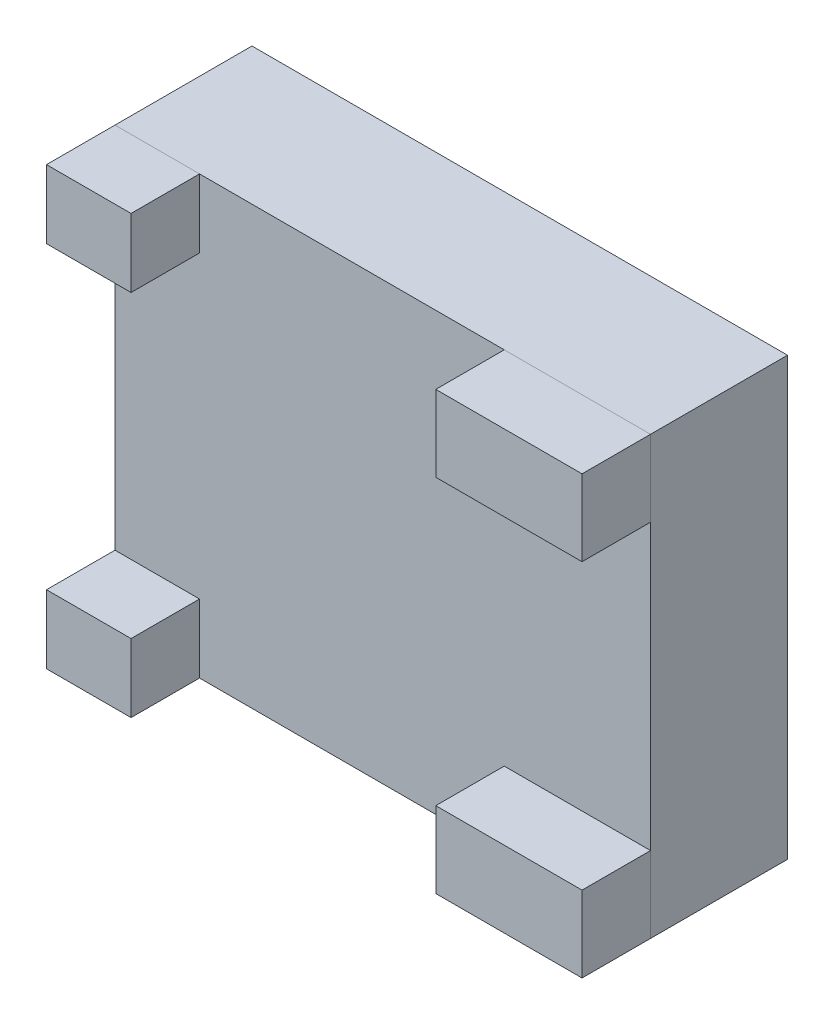
ISO-10303-21;
HEADER;
FILE_DESCRIPTION(('STEP AP214'),'2;1');
FILE_NAME('part.step','',(''),(''),'','','');
FILE_SCHEMA(('AUTOMOTIVE_DESIGN { 1 0 10303 214 1 1 1 1 }'));
ENDSEC;
DATA;
#1=APPLICATION_CONTEXT('core data for automotive mechanical design processes');
#2=APPLICATION_PROTOCOL_DEFINITION('international standard','automotive_design',2000,#1);
#3=PRODUCT_CONTEXT('',#1,'mechanical');
#4=PRODUCT('Part','Part','',(#3));
#5=PRODUCT_RELATED_PRODUCT_CATEGORY('part','',(#4));
#6=PRODUCT_DEFINITION_FORMATION('','',#4);
#7=PRODUCT_DEFINITION_CONTEXT('part definition',#1,'design');
#8=PRODUCT_DEFINITION('design','',#6,#7);
#9=PRODUCT_DEFINITION_SHAPE('','',#8);
#10=(LENGTH_UNIT() NAMED_UNIT(*) SI_UNIT(.MILLI.,.METRE.));
#11=(NAMED_UNIT(*) PLANE_ANGLE_UNIT() SI_UNIT($,.RADIAN.));
#12=(NAMED_UNIT(*) SI_UNIT($,.STERADIAN.) SOLID_ANGLE_UNIT());
#13=UNCERTAINTY_MEASURE_WITH_UNIT(LENGTH_MEASURE(1.E-05),#10,'distance_accuracy_value','');
#14=(GEOMETRIC_REPRESENTATION_CONTEXT(3) GLOBAL_UNCERTAINTY_ASSIGNED_CONTEXT((#13)) GLOBAL_UNIT_ASSIGNED_CONTEXT((#10,
#11,#12)) REPRESENTATION_CONTEXT('',''));
#15=CARTESIAN_POINT('',(0.,0.,0.));
#16=DIRECTION('',(0.,0.,1.));
#17=DIRECTION('',(1.,0.,0.));
#18=AXIS2_PLACEMENT_3D('',#15,#16,#17);
#19=CARTESIAN_POINT('',(78.1989344454509,63.755,60.));
#20=DIRECTION('',(-1.,0.,0.));
#21=DIRECTION('',(0.,0.,1.));
#22=AXIS2_PLACEMENT_3D('',#19,#20,#21);
#23=PLANE('',#22);
#24=DIRECTION('',(0.,1.,0.));
#25=VECTOR('',#24,1.);
#26=CARTESIAN_POINT('',(78.1989344454509,63.755,40.));
#27=LINE('',#26,#25);
#28=CARTESIAN_POINT('',(78.1989344454509,41.5261103187277,40.));
#29=VERTEX_POINT('',#28);
#30=CARTESIAN_POINT('',(78.1989344454509,63.755,40.));
#31=VERTEX_POINT('',#30);
#32=EDGE_CURVE('E114',#29,#31,#27,.T.);
#33=ORIENTED_EDGE('',*,*,#32,.T.);
#34=DIRECTION('',(0.,0.,-1.));
#35=VECTOR('',#34,1.);
#36=CARTESIAN_POINT('',(78.1989344454509,63.755,60.));
#37=LINE('',#36,#35);
#38=CARTESIAN_POINT('',(78.1989344454509,63.755,60.));
#39=VERTEX_POINT('',#38);
#40=EDGE_CURVE('E12',#39,#31,#37,.T.);
#41=ORIENTED_EDGE('',*,*,#40,.F.);
#42=DIRECTION('',(0.,1.,0.));
#43=VECTOR('',#42,1.);
#44=CARTESIAN_POINT('',(78.1989344454509,63.755,60.));
#45=LINE('',#44,#43);
#46=CARTESIAN_POINT('',(78.1989344454509,41.5261103187277,60.));
#47=VERTEX_POINT('',#46);
#48=EDGE_CURVE('E102',#47,#39,#45,.T.);
#49=ORIENTED_EDGE('',*,*,#48,.F.);
#50=DIRECTION('',(0.,0.,-1.));
#51=VECTOR('',#50,1.);
#52=CARTESIAN_POINT('',(78.1989344454509,41.5261103187277,60.));
#53=LINE('',#52,#51);
#54=EDGE_CURVE('E110',#47,#29,#53,.T.);
#55=ORIENTED_EDGE('',*,*,#54,.T.);
#56=EDGE_LOOP('',(#33,#41,#49,#55));
#57=FACE_BOUND('',#56,.T.);
#58=ADVANCED_FACE('F51',(#57),#23,.F.);
#59=CARTESIAN_POINT('',(78.1989344454509,63.755,60.));
#60=DIRECTION('',(0.,-1.,0.));
#61=DIRECTION('',(0.,0.,-1.));
#62=AXIS2_PLACEMENT_3D('',#59,#60,#61);
#63=PLANE('',#62);
#64=DIRECTION('',(-1.,0.,0.));
#65=VECTOR('',#64,1.);
#66=CARTESIAN_POINT('',(78.1989344454509,63.755,40.));
#67=LINE('',#66,#65);
#68=CARTESIAN_POINT('',(35.4787715814382,63.755,40.));
#69=VERTEX_POINT('',#68);
#70=EDGE_CURVE('E106',#31,#69,#67,.T.);
#71=ORIENTED_EDGE('',*,*,#70,.T.);
#72=DIRECTION('',(0.,0.,-1.));
#73=VECTOR('',#72,1.);
#74=CARTESIAN_POINT('',(35.4787715814382,63.755,60.));
#75=LINE('',#74,#73);
#76=CARTESIAN_POINT('',(35.4787715814382,63.755,60.));
#77=VERTEX_POINT('',#76);
#78=EDGE_CURVE('E59',#77,#69,#75,.T.);
#79=ORIENTED_EDGE('',*,*,#78,.F.);
#80=DIRECTION('',(-1.,0.,0.));
#81=VECTOR('',#80,1.);
#82=CARTESIAN_POINT('',(78.1989344454509,63.755,60.));
#83=LINE('',#82,#81);
#84=EDGE_CURVE('E97',#39,#77,#83,.T.);
#85=ORIENTED_EDGE('',*,*,#84,.F.);
#86=ORIENTED_EDGE('',*,*,#40,.T.);
#87=EDGE_LOOP('',(#71,#79,#85,#86));
#88=FACE_BOUND('',#87,.T.);
#89=ADVANCED_FACE('F105',(#88),#63,.F.);
#90=CARTESIAN_POINT('',(35.4787715814382,63.755,60.));
#91=DIRECTION('',(1.,0.,0.));
#92=DIRECTION('',(0.,0.,-1.));
#93=AXIS2_PLACEMENT_3D('',#90,#91,#92);
#94=PLANE('',#93);
#95=DIRECTION('',(0.,-1.,0.));
#96=VECTOR('',#95,1.);
#97=CARTESIAN_POINT('',(35.4787715814382,63.755,40.));
#98=LINE('',#97,#96);
#99=CARTESIAN_POINT('',(35.4787715814382,41.5261103187277,40.));
#100=VERTEX_POINT('',#99);
#101=EDGE_CURVE('E84',#69,#100,#98,.T.);
#102=ORIENTED_EDGE('',*,*,#101,.T.);
#103=DIRECTION('',(0.,0.,-1.));
#104=VECTOR('',#103,1.);
#105=CARTESIAN_POINT('',(35.4787715814382,41.5261103187277,60.));
#106=LINE('',#105,#104);
#107=CARTESIAN_POINT('',(35.4787715814382,41.5261103187277,60.));
#108=VERTEX_POINT('',#107);
#109=EDGE_CURVE('E107',#108,#100,#106,.T.);
#110=ORIENTED_EDGE('',*,*,#109,.F.);
#111=DIRECTION('',(0.,-1.,0.));
#112=VECTOR('',#111,1.);
#113=CARTESIAN_POINT('',(35.4787715814382,63.755,60.));
#114=LINE('',#113,#112);
#115=EDGE_CURVE('E100',#77,#108,#114,.T.);
#116=ORIENTED_EDGE('',*,*,#115,.F.);
#117=ORIENTED_EDGE('',*,*,#78,.T.);
#118=EDGE_LOOP('',(#102,#110,#116,#117));
#119=FACE_BOUND('',#118,.T.);
#120=ADVANCED_FACE('F108',(#119),#94,.F.);
#121=CARTESIAN_POINT('',(78.1989344454509,41.5261103187277,60.));
#122=DIRECTION('',(0.,1.,0.));
#123=DIRECTION('',(0.,0.,1.));
#124=AXIS2_PLACEMENT_3D('',#121,#122,#123);
#125=PLANE('',#124);
#126=DIRECTION('',(1.,0.,0.));
#127=VECTOR('',#126,1.);
#128=CARTESIAN_POINT('',(78.1989344454509,41.5261103187277,40.));
#129=LINE('',#128,#127);
#130=EDGE_CURVE('E90',#100,#29,#129,.T.);
#131=ORIENTED_EDGE('',*,*,#130,.T.);
#132=ORIENTED_EDGE('',*,*,#54,.F.);
#133=DIRECTION('',(1.,0.,0.));
#134=VECTOR('',#133,1.);
#135=CARTESIAN_POINT('',(78.1989344454509,41.5261103187277,60.));
#136=LINE('',#135,#134);
#137=EDGE_CURVE('E67',#108,#47,#136,.T.);
#138=ORIENTED_EDGE('',*,*,#137,.F.);
#139=ORIENTED_EDGE('',*,*,#109,.T.);
#140=EDGE_LOOP('',(#131,#132,#138,#139));
#141=FACE_BOUND('',#140,.T.);
#142=ADVANCED_FACE('F121',(#141),#125,.F.);
#143=CARTESIAN_POINT('',(0.,0.,60.));
#144=DIRECTION('',(0.,0.,-1.));
#145=DIRECTION('',(-1.,0.,0.));
#146=AXIS2_PLACEMENT_3D('',#143,#144,#145);
#147=PLANE('',#146);
#148=ORIENTED_EDGE('',*,*,#48,.T.);
#149=ORIENTED_EDGE('',*,*,#84,.T.);
#150=ORIENTED_EDGE('',*,*,#115,.T.);
#151=ORIENTED_EDGE('',*,*,#137,.T.);
#152=EDGE_LOOP('',(#148,#149,#150,#151));
#153=FACE_BOUND('',#152,.T.);
#154=ADVANCED_FACE('F98',(#153),#147,.F.);
#155=CARTESIAN_POINT('',(0.,0.,40.));
#156=DIRECTION('',(0.,0.,-1.));
#157=DIRECTION('',(-1.,0.,0.));
#158=AXIS2_PLACEMENT_3D('',#155,#156,#157);
#159=PLANE('',#158);
#160=ORIENTED_EDGE('',*,*,#32,.F.);
#161=ORIENTED_EDGE('',*,*,#130,.F.);
#162=ORIENTED_EDGE('',*,*,#101,.F.);
#163=ORIENTED_EDGE('',*,*,#70,.F.);
#164=EDGE_LOOP('',(#160,#161,#162,#163));
#165=FACE_BOUND('',#164,.T.);
#166=ADVANCED_FACE('F124',(#165),#159,.T.);
#167=CLOSED_SHELL('',(#58,#89,#120,#142,#154,#166));
#168=MANIFOLD_SOLID_BREP('B2',#167);
#169=CARTESIAN_POINT('',(78.1989344454509,-63.755,60.));
#170=DIRECTION('',(-1.,0.,0.));
#171=DIRECTION('',(0.,0.,1.));
#172=AXIS2_PLACEMENT_3D('',#169,#170,#171);
#173=PLANE('',#172);
#174=DIRECTION('',(0.,1.,0.));
#175=VECTOR('',#174,1.);
#176=CARTESIAN_POINT('',(78.1989344454509,-63.755,40.));
#177=LINE('',#176,#175);
#178=CARTESIAN_POINT('',(78.1989344454509,-63.755,40.));
#179=VERTEX_POINT('',#178);
#180=CARTESIAN_POINT('',(78.1989344454509,-41.5261103187277,40.));
#181=VERTEX_POINT('',#180);
#182=EDGE_CURVE('E248',#179,#181,#177,.T.);
#183=ORIENTED_EDGE('',*,*,#182,.T.);
#184=DIRECTION('',(0.,0.,-1.));
#185=VECTOR('',#184,1.);
#186=CARTESIAN_POINT('',(78.1989344454509,-41.5261103187277,60.));
#187=LINE('',#186,#185);
#188=CARTESIAN_POINT('',(78.1989344454509,-41.5261103187277,60.));
#189=VERTEX_POINT('',#188);
#190=EDGE_CURVE('E49',#189,#181,#187,.T.);
#191=ORIENTED_EDGE('',*,*,#190,.F.);
#192=DIRECTION('',(0.,1.,0.));
#193=VECTOR('',#192,1.);
#194=CARTESIAN_POINT('',(78.1989344454509,-63.755,60.));
#195=LINE('',#194,#193);
#196=CARTESIAN_POINT('',(78.1989344454509,-63.755,60.));
#197=VERTEX_POINT('',#196);
#198=EDGE_CURVE('E236',#197,#189,#195,.T.);
#199=ORIENTED_EDGE('',*,*,#198,.F.);
#200=DIRECTION('',(0.,0.,-1.));
#201=VECTOR('',#200,1.);
#202=CARTESIAN_POINT('',(78.1989344454509,-63.755,60.));
#203=LINE('',#202,#201);
#204=EDGE_CURVE('E244',#197,#179,#203,.T.);
#205=ORIENTED_EDGE('',*,*,#204,.T.);
#206=EDGE_LOOP('',(#183,#191,#199,#205));
#207=FACE_BOUND('',#206,.T.);
#208=ADVANCED_FACE('F185',(#207),#173,.F.);
#209=CARTESIAN_POINT('',(78.1989344454509,-41.5261103187277,60.));
#210=DIRECTION('',(0.,-1.,0.));
#211=DIRECTION('',(0.,0.,-1.));
#212=AXIS2_PLACEMENT_3D('',#209,#210,#211);
#213=PLANE('',#212);
#214=DIRECTION('',(-1.,0.,0.));
#215=VECTOR('',#214,1.);
#216=CARTESIAN_POINT('',(78.1989344454509,-41.5261103187277,40.));
#217=LINE('',#216,#215);
#218=CARTESIAN_POINT('',(35.4787715814382,-41.5261103187277,40.));
#219=VERTEX_POINT('',#218);
#220=EDGE_CURVE('E240',#181,#219,#217,.T.);
#221=ORIENTED_EDGE('',*,*,#220,.T.);
#222=DIRECTION('',(0.,0.,-1.));
#223=VECTOR('',#222,1.);
#224=CARTESIAN_POINT('',(35.4787715814382,-41.5261103187277,60.));
#225=LINE('',#224,#223);
#226=CARTESIAN_POINT('',(35.4787715814382,-41.5261103187277,60.));
#227=VERTEX_POINT('',#226);
#228=EDGE_CURVE('E193',#227,#219,#225,.T.);
#229=ORIENTED_EDGE('',*,*,#228,.F.);
#230=DIRECTION('',(-1.,0.,0.));
#231=VECTOR('',#230,1.);
#232=CARTESIAN_POINT('',(78.1989344454509,-41.5261103187277,60.));
#233=LINE('',#232,#231);
#234=EDGE_CURVE('E231',#189,#227,#233,.T.);
#235=ORIENTED_EDGE('',*,*,#234,.F.);
#236=ORIENTED_EDGE('',*,*,#190,.T.);
#237=EDGE_LOOP('',(#221,#229,#235,#236));
#238=FACE_BOUND('',#237,.T.);
#239=ADVANCED_FACE('F239',(#238),#213,.F.);
#240=CARTESIAN_POINT('',(35.4787715814382,-63.755,60.));
#241=DIRECTION('',(1.,0.,0.));
#242=DIRECTION('',(0.,0.,-1.));
#243=AXIS2_PLACEMENT_3D('',#240,#241,#242);
#244=PLANE('',#243);
#245=DIRECTION('',(0.,-1.,0.));
#246=VECTOR('',#245,1.);
#247=CARTESIAN_POINT('',(35.4787715814382,-63.755,40.));
#248=LINE('',#247,#246);
#249=CARTESIAN_POINT('',(35.4787715814382,-63.755,40.));
#250=VERTEX_POINT('',#249);
#251=EDGE_CURVE('E218',#219,#250,#248,.T.);
#252=ORIENTED_EDGE('',*,*,#251,.T.);
#253=DIRECTION('',(0.,0.,-1.));
#254=VECTOR('',#253,1.);
#255=CARTESIAN_POINT('',(35.4787715814382,-63.755,60.));
#256=LINE('',#255,#254);
#257=CARTESIAN_POINT('',(35.4787715814382,-63.755,60.));
#258=VERTEX_POINT('',#257);
#259=EDGE_CURVE('E241',#258,#250,#256,.T.);
#260=ORIENTED_EDGE('',*,*,#259,.F.);
#261=DIRECTION('',(0.,-1.,0.));
#262=VECTOR('',#261,1.);
#263=CARTESIAN_POINT('',(35.4787715814382,-63.755,60.));
#264=LINE('',#263,#262);
#265=EDGE_CURVE('E234',#227,#258,#264,.T.);
#266=ORIENTED_EDGE('',*,*,#265,.F.);
#267=ORIENTED_EDGE('',*,*,#228,.T.);
#268=EDGE_LOOP('',(#252,#260,#266,#267));
#269=FACE_BOUND('',#268,.T.);
#270=ADVANCED_FACE('F242',(#269),#244,.F.);
#271=CARTESIAN_POINT('',(78.1989344454509,-63.755,60.));
#272=DIRECTION('',(0.,1.,0.));
#273=DIRECTION('',(0.,0.,1.));
#274=AXIS2_PLACEMENT_3D('',#271,#272,#273);
#275=PLANE('',#274);
#276=DIRECTION('',(1.,0.,0.));
#277=VECTOR('',#276,1.);
#278=CARTESIAN_POINT('',(78.1989344454509,-63.755,40.));
#279=LINE('',#278,#277);
#280=EDGE_CURVE('E224',#250,#179,#279,.T.);
#281=ORIENTED_EDGE('',*,*,#280,.T.);
#282=ORIENTED_EDGE('',*,*,#204,.F.);
#283=DIRECTION('',(1.,0.,0.));
#284=VECTOR('',#283,1.);
#285=CARTESIAN_POINT('',(78.1989344454509,-63.755,60.));
#286=LINE('',#285,#284);
#287=EDGE_CURVE('E201',#258,#197,#286,.T.);
#288=ORIENTED_EDGE('',*,*,#287,.F.);
#289=ORIENTED_EDGE('',*,*,#259,.T.);
#290=EDGE_LOOP('',(#281,#282,#288,#289));
#291=FACE_BOUND('',#290,.T.);
#292=ADVANCED_FACE('F255',(#291),#275,.F.);
#293=CARTESIAN_POINT('',(0.,0.,60.));
#294=DIRECTION('',(0.,0.,1.));
#295=DIRECTION('',(1.,0.,0.));
#296=AXIS2_PLACEMENT_3D('',#293,#294,#295);
#297=PLANE('',#296);
#298=ORIENTED_EDGE('',*,*,#198,.T.);
#299=ORIENTED_EDGE('',*,*,#234,.T.);
#300=ORIENTED_EDGE('',*,*,#265,.T.);
#301=ORIENTED_EDGE('',*,*,#287,.T.);
#302=EDGE_LOOP('',(#298,#299,#300,#301));
#303=FACE_BOUND('',#302,.T.);
#304=ADVANCED_FACE('F232',(#303),#297,.T.);
#305=CARTESIAN_POINT('',(0.,0.,40.));
#306=DIRECTION('',(0.,0.,1.));
#307=DIRECTION('',(1.,0.,0.));
#308=AXIS2_PLACEMENT_3D('',#305,#306,#307);
#309=PLANE('',#308);
#310=ORIENTED_EDGE('',*,*,#182,.F.);
#311=ORIENTED_EDGE('',*,*,#280,.F.);
#312=ORIENTED_EDGE('',*,*,#251,.F.);
#313=ORIENTED_EDGE('',*,*,#220,.F.);
#314=EDGE_LOOP('',(#310,#311,#312,#313));
#315=FACE_BOUND('',#314,.T.);
#316=ADVANCED_FACE('F258',(#315),#309,.F.);
#317=CLOSED_SHELL('',(#208,#239,#270,#292,#304,#316));
#318=MANIFOLD_SOLID_BREP('B6',#317);
#319=CARTESIAN_POINT('',(-78.1989344454509,63.755,60.));
#320=DIRECTION('',(1.,0.,0.));
#321=DIRECTION('',(0.,1.,0.));
#322=AXIS2_PLACEMENT_3D('',#319,#320,#321);
#323=PLANE('',#322);
#324=DIRECTION('',(0.,-1.,0.));
#325=VECTOR('',#324,1.);
#326=CARTESIAN_POINT('',(-78.1989344454509,63.755,40.));
#327=LINE('',#326,#325);
#328=CARTESIAN_POINT('',(-78.1989344454509,63.755,40.));
#329=VERTEX_POINT('',#328);
#330=CARTESIAN_POINT('',(-78.198934445451,43.755,40.));
#331=VERTEX_POINT('',#330);
#332=EDGE_CURVE('E382',#329,#331,#327,.T.);
#333=ORIENTED_EDGE('',*,*,#332,.T.);
#334=DIRECTION('',(0.,0.,-1.));
#335=VECTOR('',#334,1.);
#336=CARTESIAN_POINT('',(-78.198934445451,43.755,60.));
#337=LINE('',#336,#335);
#338=CARTESIAN_POINT('',(-78.198934445451,43.755,60.));
#339=VERTEX_POINT('',#338);
#340=EDGE_CURVE('E183',#339,#331,#337,.T.);
#341=ORIENTED_EDGE('',*,*,#340,.F.);
#342=DIRECTION('',(0.,-1.,0.));
#343=VECTOR('',#342,1.);
#344=CARTESIAN_POINT('',(-78.1989344454509,63.755,60.));
#345=LINE('',#344,#343);
#346=CARTESIAN_POINT('',(-78.1989344454509,63.755,60.));
#347=VERTEX_POINT('',#346);
#348=EDGE_CURVE('E370',#347,#339,#345,.T.);
#349=ORIENTED_EDGE('',*,*,#348,.F.);
#350=DIRECTION('',(0.,0.,-1.));
#351=VECTOR('',#350,1.);
#352=CARTESIAN_POINT('',(-78.1989344454509,63.755,60.));
#353=LINE('',#352,#351);
#354=EDGE_CURVE('E378',#347,#329,#353,.T.);
#355=ORIENTED_EDGE('',*,*,#354,.T.);
#356=EDGE_LOOP('',(#333,#341,#349,#355));
#357=FACE_BOUND('',#356,.T.);
#358=ADVANCED_FACE('F319',(#357),#323,.F.);
#359=CARTESIAN_POINT('',(-78.198934445451,43.755,60.));
#360=DIRECTION('',(0.,1.,0.));
#361=DIRECTION('',(0.,0.,1.));
#362=AXIS2_PLACEMENT_3D('',#359,#360,#361);
#363=PLANE('',#362);
#364=DIRECTION('',(1.,0.,0.));
#365=VECTOR('',#364,1.);
#366=CARTESIAN_POINT('',(-78.198934445451,43.755,40.));
#367=LINE('',#366,#365);
#368=CARTESIAN_POINT('',(-53.5078684473547,43.755,40.));
#369=VERTEX_POINT('',#368);
#370=EDGE_CURVE('E374',#331,#369,#367,.T.);
#371=ORIENTED_EDGE('',*,*,#370,.T.);
#372=DIRECTION('',(0.,0.,-1.));
#373=VECTOR('',#372,1.);
#374=CARTESIAN_POINT('',(-53.5078684473547,43.755,60.));
#375=LINE('',#374,#373);
#376=CARTESIAN_POINT('',(-53.5078684473547,43.755,60.));
#377=VERTEX_POINT('',#376);
#378=EDGE_CURVE('E327',#377,#369,#375,.T.);
#379=ORIENTED_EDGE('',*,*,#378,.F.);
#380=DIRECTION('',(1.,0.,0.));
#381=VECTOR('',#380,1.);
#382=CARTESIAN_POINT('',(-78.198934445451,43.755,60.));
#383=LINE('',#382,#381);
#384=EDGE_CURVE('E365',#339,#377,#383,.T.);
#385=ORIENTED_EDGE('',*,*,#384,.F.);
#386=ORIENTED_EDGE('',*,*,#340,.T.);
#387=EDGE_LOOP('',(#371,#379,#385,#386));
#388=FACE_BOUND('',#387,.T.);
#389=ADVANCED_FACE('F373',(#388),#363,.F.);
#390=CARTESIAN_POINT('',(-53.5078684473547,63.755,60.));
#391=DIRECTION('',(-1.,0.,0.));
#392=DIRECTION('',(0.,-1.,0.));
#393=AXIS2_PLACEMENT_3D('',#390,#391,#392);
#394=PLANE('',#393);
#395=DIRECTION('',(0.,1.,0.));
#396=VECTOR('',#395,1.);
#397=CARTESIAN_POINT('',(-53.5078684473547,63.755,40.));
#398=LINE('',#397,#396);
#399=CARTESIAN_POINT('',(-53.5078684473547,63.755,40.));
#400=VERTEX_POINT('',#399);
#401=EDGE_CURVE('E352',#369,#400,#398,.T.);
#402=ORIENTED_EDGE('',*,*,#401,.T.);
#403=DIRECTION('',(0.,0.,-1.));
#404=VECTOR('',#403,1.);
#405=CARTESIAN_POINT('',(-53.5078684473547,63.755,60.));
#406=LINE('',#405,#404);
#407=CARTESIAN_POINT('',(-53.5078684473547,63.755,60.));
#408=VERTEX_POINT('',#407);
#409=EDGE_CURVE('E375',#408,#400,#406,.T.);
#410=ORIENTED_EDGE('',*,*,#409,.F.);
#411=DIRECTION('',(0.,1.,0.));
#412=VECTOR('',#411,1.);
#413=CARTESIAN_POINT('',(-53.5078684473547,63.755,60.));
#414=LINE('',#413,#412);
#415=EDGE_CURVE('E368',#377,#408,#414,.T.);
#416=ORIENTED_EDGE('',*,*,#415,.F.);
#417=ORIENTED_EDGE('',*,*,#378,.T.);
#418=EDGE_LOOP('',(#402,#410,#416,#417));
#419=FACE_BOUND('',#418,.T.);
#420=ADVANCED_FACE('F376',(#419),#394,.F.);
#421=CARTESIAN_POINT('',(-78.1989344454509,63.755,60.));
#422=DIRECTION('',(0.,-1.,0.));
#423=DIRECTION('',(0.,0.,-1.));
#424=AXIS2_PLACEMENT_3D('',#421,#422,#423);
#425=PLANE('',#424);
#426=DIRECTION('',(-1.,0.,0.));
#427=VECTOR('',#426,1.);
#428=CARTESIAN_POINT('',(-78.1989344454509,63.755,40.));
#429=LINE('',#428,#427);
#430=EDGE_CURVE('E358',#400,#329,#429,.T.);
#431=ORIENTED_EDGE('',*,*,#430,.T.);
#432=ORIENTED_EDGE('',*,*,#354,.F.);
#433=DIRECTION('',(-1.,0.,0.));
#434=VECTOR('',#433,1.);
#435=CARTESIAN_POINT('',(-78.1989344454509,63.755,60.));
#436=LINE('',#435,#434);
#437=EDGE_CURVE('E335',#408,#347,#436,.T.);
#438=ORIENTED_EDGE('',*,*,#437,.F.);
#439=ORIENTED_EDGE('',*,*,#409,.T.);
#440=EDGE_LOOP('',(#431,#432,#438,#439));
#441=FACE_BOUND('',#440,.T.);
#442=ADVANCED_FACE('F389',(#441),#425,.F.);
#443=CARTESIAN_POINT('',(0.,0.,60.));
#444=DIRECTION('',(0.,0.,1.));
#445=DIRECTION('',(1.,0.,0.));
#446=AXIS2_PLACEMENT_3D('',#443,#444,#445);
#447=PLANE('',#446);
#448=ORIENTED_EDGE('',*,*,#348,.T.);
#449=ORIENTED_EDGE('',*,*,#384,.T.);
#450=ORIENTED_EDGE('',*,*,#415,.T.);
#451=ORIENTED_EDGE('',*,*,#437,.T.);
#452=EDGE_LOOP('',(#448,#449,#450,#451));
#453=FACE_BOUND('',#452,.T.);
#454=ADVANCED_FACE('F366',(#453),#447,.T.);
#455=CARTESIAN_POINT('',(0.,0.,40.));
#456=DIRECTION('',(0.,0.,1.));
#457=DIRECTION('',(1.,0.,0.));
#458=AXIS2_PLACEMENT_3D('',#455,#456,#457);
#459=PLANE('',#458);
#460=ORIENTED_EDGE('',*,*,#332,.F.);
#461=ORIENTED_EDGE('',*,*,#430,.F.);
#462=ORIENTED_EDGE('',*,*,#401,.F.);
#463=ORIENTED_EDGE('',*,*,#370,.F.);
#464=EDGE_LOOP('',(#460,#461,#462,#463));
#465=FACE_BOUND('',#464,.T.);
#466=ADVANCED_FACE('F392',(#465),#459,.F.);
#467=CLOSED_SHELL('',(#358,#389,#420,#442,#454,#466));
#468=MANIFOLD_SOLID_BREP('B43',#467);
#469=CARTESIAN_POINT('',(-78.1989344454509,-63.755,60.));
#470=DIRECTION('',(1.,0.,0.));
#471=DIRECTION('',(0.,1.,0.));
#472=AXIS2_PLACEMENT_3D('',#469,#470,#471);
#473=PLANE('',#472);
#474=DIRECTION('',(0.,-1.,0.));
#475=VECTOR('',#474,1.);
#476=CARTESIAN_POINT('',(-78.1989344454509,-63.755,40.));
#477=LINE('',#476,#475);
#478=CARTESIAN_POINT('',(-78.198934445451,-43.755,40.));
#479=VERTEX_POINT('',#478);
#480=CARTESIAN_POINT('',(-78.1989344454509,-63.755,40.));
#481=VERTEX_POINT('',#480);
#482=EDGE_CURVE('E515',#479,#481,#477,.T.);
#483=ORIENTED_EDGE('',*,*,#482,.T.);
#484=DIRECTION('',(0.,0.,-1.));
#485=VECTOR('',#484,1.);
#486=CARTESIAN_POINT('',(-78.1989344454509,-63.755,60.));
#487=LINE('',#486,#485);
#488=CARTESIAN_POINT('',(-78.1989344454509,-63.755,60.));
#489=VERTEX_POINT('',#488);
#490=EDGE_CURVE('E317',#489,#481,#487,.T.);
#491=ORIENTED_EDGE('',*,*,#490,.F.);
#492=DIRECTION('',(0.,-1.,0.));
#493=VECTOR('',#492,1.);
#494=CARTESIAN_POINT('',(-78.1989344454509,-63.755,60.));
#495=LINE('',#494,#493);
#496=CARTESIAN_POINT('',(-78.198934445451,-43.755,60.));
#497=VERTEX_POINT('',#496);
#498=EDGE_CURVE('E503',#497,#489,#495,.T.);
#499=ORIENTED_EDGE('',*,*,#498,.F.);
#500=DIRECTION('',(0.,0.,-1.));
#501=VECTOR('',#500,1.);
#502=CARTESIAN_POINT('',(-78.198934445451,-43.755,60.));
#503=LINE('',#502,#501);
#504=EDGE_CURVE('E511',#497,#479,#503,.T.);
#505=ORIENTED_EDGE('',*,*,#504,.T.);
#506=EDGE_LOOP('',(#483,#491,#499,#505));
#507=FACE_BOUND('',#506,.T.);
#508=ADVANCED_FACE('F452',(#507),#473,.F.);
#509=CARTESIAN_POINT('',(-78.1989344454509,-63.755,60.));
#510=DIRECTION('',(0.,1.,0.));
#511=DIRECTION('',(0.,0.,1.));
#512=AXIS2_PLACEMENT_3D('',#509,#510,#511);
#513=PLANE('',#512);
#514=DIRECTION('',(1.,0.,0.));
#515=VECTOR('',#514,1.);
#516=CARTESIAN_POINT('',(-78.1989344454509,-63.755,40.));
#517=LINE('',#516,#515);
#518=CARTESIAN_POINT('',(-53.5078684473547,-63.755,40.));
#519=VERTEX_POINT('',#518);
#520=EDGE_CURVE('E507',#481,#519,#517,.T.);
#521=ORIENTED_EDGE('',*,*,#520,.T.);
#522=DIRECTION('',(0.,0.,-1.));
#523=VECTOR('',#522,1.);
#524=CARTESIAN_POINT('',(-53.5078684473547,-63.755,60.));
#525=LINE('',#524,#523);
#526=CARTESIAN_POINT('',(-53.5078684473547,-63.755,60.));
#527=VERTEX_POINT('',#526);
#528=EDGE_CURVE('E460',#527,#519,#525,.T.);
#529=ORIENTED_EDGE('',*,*,#528,.F.);
#530=DIRECTION('',(1.,0.,0.));
#531=VECTOR('',#530,1.);
#532=CARTESIAN_POINT('',(-78.1989344454509,-63.755,60.));
#533=LINE('',#532,#531);
#534=EDGE_CURVE('E498',#489,#527,#533,.T.);
#535=ORIENTED_EDGE('',*,*,#534,.F.);
#536=ORIENTED_EDGE('',*,*,#490,.T.);
#537=EDGE_LOOP('',(#521,#529,#535,#536));
#538=FACE_BOUND('',#537,.T.);
#539=ADVANCED_FACE('F506',(#538),#513,.F.);
#540=CARTESIAN_POINT('',(-53.5078684473547,-63.755,60.));
#541=DIRECTION('',(-1.,0.,0.));
#542=DIRECTION('',(0.,0.,1.));
#543=AXIS2_PLACEMENT_3D('',#540,#541,#542);
#544=PLANE('',#543);
#545=DIRECTION('',(0.,1.,0.));
#546=VECTOR('',#545,1.);
#547=CARTESIAN_POINT('',(-53.5078684473547,-63.755,40.));
#548=LINE('',#547,#546);
#549=CARTESIAN_POINT('',(-53.5078684473547,-43.755,40.));
#550=VERTEX_POINT('',#549);
#551=EDGE_CURVE('E485',#519,#550,#548,.T.);
#552=ORIENTED_EDGE('',*,*,#551,.T.);
#553=DIRECTION('',(0.,0.,-1.));
#554=VECTOR('',#553,1.);
#555=CARTESIAN_POINT('',(-53.5078684473547,-43.755,60.));
#556=LINE('',#555,#554);
#557=CARTESIAN_POINT('',(-53.5078684473547,-43.755,60.));
#558=VERTEX_POINT('',#557);
#559=EDGE_CURVE('E508',#558,#550,#556,.T.);
#560=ORIENTED_EDGE('',*,*,#559,.F.);
#561=DIRECTION('',(0.,1.,0.));
#562=VECTOR('',#561,1.);
#563=CARTESIAN_POINT('',(-53.5078684473547,-63.755,60.));
#564=LINE('',#563,#562);
#565=EDGE_CURVE('E501',#527,#558,#564,.T.);
#566=ORIENTED_EDGE('',*,*,#565,.F.);
#567=ORIENTED_EDGE('',*,*,#528,.T.);
#568=EDGE_LOOP('',(#552,#560,#566,#567));
#569=FACE_BOUND('',#568,.T.);
#570=ADVANCED_FACE('F509',(#569),#544,.F.);
#571=CARTESIAN_POINT('',(-78.198934445451,-43.755,60.));
#572=DIRECTION('',(0.,-1.,0.));
#573=DIRECTION('',(0.,0.,-1.));
#574=AXIS2_PLACEMENT_3D('',#571,#572,#573);
#575=PLANE('',#574);
#576=DIRECTION('',(-1.,0.,0.));
#577=VECTOR('',#576,1.);
#578=CARTESIAN_POINT('',(-78.198934445451,-43.755,40.));
#579=LINE('',#578,#577);
#580=EDGE_CURVE('E491',#550,#479,#579,.T.);
#581=ORIENTED_EDGE('',*,*,#580,.T.);
#582=ORIENTED_EDGE('',*,*,#504,.F.);
#583=DIRECTION('',(-1.,0.,0.));
#584=VECTOR('',#583,1.);
#585=CARTESIAN_POINT('',(-78.198934445451,-43.755,60.));
#586=LINE('',#585,#584);
#587=EDGE_CURVE('E468',#558,#497,#586,.T.);
#588=ORIENTED_EDGE('',*,*,#587,.F.);
#589=ORIENTED_EDGE('',*,*,#559,.T.);
#590=EDGE_LOOP('',(#581,#582,#588,#589));
#591=FACE_BOUND('',#590,.T.);
#592=ADVANCED_FACE('F522',(#591),#575,.F.);
#593=CARTESIAN_POINT('',(0.,0.,60.));
#594=DIRECTION('',(0.,0.,-1.));
#595=DIRECTION('',(-1.,0.,0.));
#596=AXIS2_PLACEMENT_3D('',#593,#594,#595);
#597=PLANE('',#596);
#598=ORIENTED_EDGE('',*,*,#498,.T.);
#599=ORIENTED_EDGE('',*,*,#534,.T.);
#600=ORIENTED_EDGE('',*,*,#565,.T.);
#601=ORIENTED_EDGE('',*,*,#587,.T.);
#602=EDGE_LOOP('',(#598,#599,#600,#601));
#603=FACE_BOUND('',#602,.T.);
#604=ADVANCED_FACE('F499',(#603),#597,.F.);
#605=CARTESIAN_POINT('',(0.,0.,40.));
#606=DIRECTION('',(0.,0.,-1.));
#607=DIRECTION('',(-1.,0.,0.));
#608=AXIS2_PLACEMENT_3D('',#605,#606,#607);
#609=PLANE('',#608);
#610=ORIENTED_EDGE('',*,*,#482,.F.);
#611=ORIENTED_EDGE('',*,*,#580,.F.);
#612=ORIENTED_EDGE('',*,*,#551,.F.);
#613=ORIENTED_EDGE('',*,*,#520,.F.);
#614=EDGE_LOOP('',(#610,#611,#612,#613));
#615=FACE_BOUND('',#614,.T.);
#616=ADVANCED_FACE('F525',(#615),#609,.T.);
#617=CLOSED_SHELL('',(#508,#539,#570,#592,#604,#616));
#618=MANIFOLD_SOLID_BREP('B177',#617);
#619=CARTESIAN_POINT('',(78.1989344454509,-63.755,40.));
#620=DIRECTION('',(-1.,0.,0.));
#621=DIRECTION('',(0.,0.,1.));
#622=AXIS2_PLACEMENT_3D('',#619,#620,#621);
#623=PLANE('',#622);
#624=DIRECTION('',(0.,1.,0.));
#625=VECTOR('',#624,1.);
#626=CARTESIAN_POINT('',(78.1989344454509,-63.755,0.));
#627=LINE('',#626,#625);
#628=CARTESIAN_POINT('',(78.1989344454509,-63.755,0.));
#629=VERTEX_POINT('',#628);
#630=CARTESIAN_POINT('',(78.1989344454509,63.755,0.));
#631=VERTEX_POINT('',#630);
#632=EDGE_CURVE('E639',#629,#631,#627,.T.);
#633=ORIENTED_EDGE('',*,*,#632,.T.);
#634=DIRECTION('',(0.,0.,-1.));
#635=VECTOR('',#634,1.);
#636=CARTESIAN_POINT('',(78.1989344454509,63.755,40.));
#637=LINE('',#636,#635);
#638=CARTESIAN_POINT('',(78.1989344454509,63.755,40.));
#639=VERTEX_POINT('',#638);
#640=EDGE_CURVE('E450',#639,#631,#637,.T.);
#641=ORIENTED_EDGE('',*,*,#640,.F.);
#642=DIRECTION('',(0.,1.,0.));
#643=VECTOR('',#642,1.);
#644=CARTESIAN_POINT('',(78.1989344454509,-63.755,40.));
#645=LINE('',#644,#643);
#646=CARTESIAN_POINT('',(78.1989344454509,-63.755,40.));
#647=VERTEX_POINT('',#646);
#648=EDGE_CURVE('E627',#647,#639,#645,.T.);
#649=ORIENTED_EDGE('',*,*,#648,.F.);
#650=DIRECTION('',(0.,0.,-1.));
#651=VECTOR('',#650,1.);
#652=CARTESIAN_POINT('',(78.1989344454509,-63.755,40.));
#653=LINE('',#652,#651);
#654=EDGE_CURVE('E635',#647,#629,#653,.T.);
#655=ORIENTED_EDGE('',*,*,#654,.T.);
#656=EDGE_LOOP('',(#633,#641,#649,#655));
#657=FACE_BOUND('',#656,.T.);
#658=ADVANCED_FACE('F576',(#657),#623,.F.);
#659=CARTESIAN_POINT('',(-78.1989344454509,63.755,40.));
#660=DIRECTION('',(0.,-1.,0.));
#661=DIRECTION('',(0.,0.,-1.));
#662=AXIS2_PLACEMENT_3D('',#659,#660,#661);
#663=PLANE('',#662);
#664=DIRECTION('',(-1.,0.,0.));
#665=VECTOR('',#664,1.);
#666=CARTESIAN_POINT('',(-78.1989344454509,63.755,0.));
#667=LINE('',#666,#665);
#668=CARTESIAN_POINT('',(-78.1989344454509,63.755,0.));
#669=VERTEX_POINT('',#668);
#670=EDGE_CURVE('E631',#631,#669,#667,.T.);
#671=ORIENTED_EDGE('',*,*,#670,.T.);
#672=DIRECTION('',(0.,0.,-1.));
#673=VECTOR('',#672,1.);
#674=CARTESIAN_POINT('',(-78.1989344454509,63.755,40.));
#675=LINE('',#674,#673);
#676=CARTESIAN_POINT('',(-78.1989344454509,63.755,40.));
#677=VERTEX_POINT('',#676);
#678=EDGE_CURVE('E584',#677,#669,#675,.T.);
#679=ORIENTED_EDGE('',*,*,#678,.F.);
#680=DIRECTION('',(-1.,0.,0.));
#681=VECTOR('',#680,1.);
#682=CARTESIAN_POINT('',(-78.1989344454509,63.755,40.));
#683=LINE('',#682,#681);
#684=EDGE_CURVE('E622',#639,#677,#683,.T.);
#685=ORIENTED_EDGE('',*,*,#684,.F.);
#686=ORIENTED_EDGE('',*,*,#640,.T.);
#687=EDGE_LOOP('',(#671,#679,#685,#686));
#688=FACE_BOUND('',#687,.T.);
#689=ADVANCED_FACE('F630',(#688),#663,.F.);
#690=CARTESIAN_POINT('',(-78.1989344454509,-63.755,40.));
#691=DIRECTION('',(1.,0.,0.));
#692=DIRECTION('',(0.,0.,-1.));
#693=AXIS2_PLACEMENT_3D('',#690,#691,#692);
#694=PLANE('',#693);
#695=DIRECTION('',(0.,-1.,0.));
#696=VECTOR('',#695,1.);
#697=CARTESIAN_POINT('',(-78.1989344454509,-63.755,0.));
#698=LINE('',#697,#696);
#699=CARTESIAN_POINT('',(-78.1989344454509,-63.755,0.));
#700=VERTEX_POINT('',#699);
#701=EDGE_CURVE('E609',#669,#700,#698,.T.);
#702=ORIENTED_EDGE('',*,*,#701,.T.);
#703=DIRECTION('',(0.,0.,-1.));
#704=VECTOR('',#703,1.);
#705=CARTESIAN_POINT('',(-78.1989344454509,-63.755,40.));
#706=LINE('',#705,#704);
#707=CARTESIAN_POINT('',(-78.1989344454509,-63.755,40.));
#708=VERTEX_POINT('',#707);
#709=EDGE_CURVE('E632',#708,#700,#706,.T.);
#710=ORIENTED_EDGE('',*,*,#709,.F.);
#711=DIRECTION('',(0.,-1.,0.));
#712=VECTOR('',#711,1.);
#713=CARTESIAN_POINT('',(-78.1989344454509,-63.755,40.));
#714=LINE('',#713,#712);
#715=EDGE_CURVE('E625',#677,#708,#714,.T.);
#716=ORIENTED_EDGE('',*,*,#715,.F.);
#717=ORIENTED_EDGE('',*,*,#678,.T.);
#718=EDGE_LOOP('',(#702,#710,#716,#717));
#719=FACE_BOUND('',#718,.T.);
#720=ADVANCED_FACE('F633',(#719),#694,.F.);
#721=CARTESIAN_POINT('',(-78.1989344454509,-63.755,40.));
#722=DIRECTION('',(0.,1.,0.));
#723=DIRECTION('',(0.,0.,1.));
#724=AXIS2_PLACEMENT_3D('',#721,#722,#723);
#725=PLANE('',#724);
#726=DIRECTION('',(1.,0.,0.));
#727=VECTOR('',#726,1.);
#728=CARTESIAN_POINT('',(-78.1989344454509,-63.755,0.));
#729=LINE('',#728,#727);
#730=EDGE_CURVE('E615',#700,#629,#729,.T.);
#731=ORIENTED_EDGE('',*,*,#730,.T.);
#732=ORIENTED_EDGE('',*,*,#654,.F.);
#733=DIRECTION('',(1.,0.,0.));
#734=VECTOR('',#733,1.);
#735=CARTESIAN_POINT('',(-78.1989344454509,-63.755,40.));
#736=LINE('',#735,#734);
#737=EDGE_CURVE('E592',#708,#647,#736,.T.);
#738=ORIENTED_EDGE('',*,*,#737,.F.);
#739=ORIENTED_EDGE('',*,*,#709,.T.);
#740=EDGE_LOOP('',(#731,#732,#738,#739));
#741=FACE_BOUND('',#740,.T.);
#742=ADVANCED_FACE('F646',(#741),#725,.F.);
#743=CARTESIAN_POINT('',(0.,0.,40.));
#744=DIRECTION('',(0.,0.,-1.));
#745=DIRECTION('',(-1.,0.,0.));
#746=AXIS2_PLACEMENT_3D('',#743,#744,#745);
#747=PLANE('',#746);
#748=ORIENTED_EDGE('',*,*,#648,.T.);
#749=ORIENTED_EDGE('',*,*,#684,.T.);
#750=ORIENTED_EDGE('',*,*,#715,.T.);
#751=ORIENTED_EDGE('',*,*,#737,.T.);
#752=EDGE_LOOP('',(#748,#749,#750,#751));
#753=FACE_BOUND('',#752,.T.);
#754=ADVANCED_FACE('F623',(#753),#747,.F.);
#755=CARTESIAN_POINT('',(0.,0.,0.));
#756=DIRECTION('',(0.,0.,-1.));
#757=DIRECTION('',(-1.,0.,0.));
#758=AXIS2_PLACEMENT_3D('',#755,#756,#757);
#759=PLANE('',#758);
#760=ORIENTED_EDGE('',*,*,#632,.F.);
#761=ORIENTED_EDGE('',*,*,#730,.F.);
#762=ORIENTED_EDGE('',*,*,#701,.F.);
#763=ORIENTED_EDGE('',*,*,#670,.F.);
#764=EDGE_LOOP('',(#760,#761,#762,#763));
#765=FACE_BOUND('',#764,.T.);
#766=ADVANCED_FACE('F649',(#765),#759,.T.);
#767=CLOSED_SHELL('',(#658,#689,#720,#742,#754,#766));
#768=MANIFOLD_SOLID_BREP('B311',#767);
#769=ADVANCED_BREP_SHAPE_REPRESENTATION('',(#18,#168,#318,#468,#618,#768),#14);
#770=SHAPE_DEFINITION_REPRESENTATION(#9,#769);
ENDSEC;
END-ISO-10303-21;
